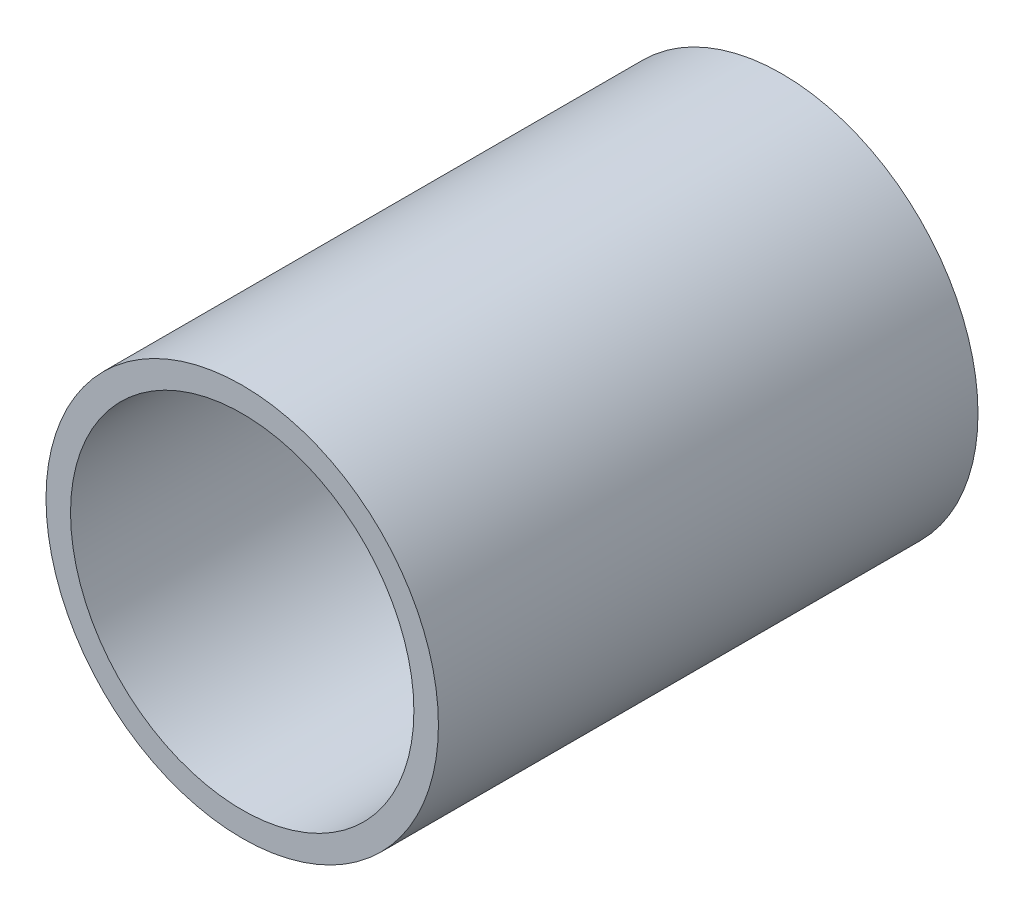
ISO-10303-21;
HEADER;
FILE_DESCRIPTION(('STEP AP214'),'2;1');
FILE_NAME('part.step','',(''),(''),'','','');
FILE_SCHEMA(('AUTOMOTIVE_DESIGN { 1 0 10303 214 1 1 1 1 }'));
ENDSEC;
DATA;
#1=APPLICATION_CONTEXT('core data for automotive mechanical design processes');
#2=APPLICATION_PROTOCOL_DEFINITION('international standard','automotive_design',2000,#1);
#3=PRODUCT_CONTEXT('',#1,'mechanical');
#4=PRODUCT('Part','Part','',(#3));
#5=PRODUCT_RELATED_PRODUCT_CATEGORY('part','',(#4));
#6=PRODUCT_DEFINITION_FORMATION('','',#4);
#7=PRODUCT_DEFINITION_CONTEXT('part definition',#1,'design');
#8=PRODUCT_DEFINITION('design','',#6,#7);
#9=PRODUCT_DEFINITION_SHAPE('','',#8);
#10=(LENGTH_UNIT() NAMED_UNIT(*) SI_UNIT(.MILLI.,.METRE.));
#11=(NAMED_UNIT(*) PLANE_ANGLE_UNIT() SI_UNIT($,.RADIAN.));
#12=(NAMED_UNIT(*) SI_UNIT($,.STERADIAN.) SOLID_ANGLE_UNIT());
#13=UNCERTAINTY_MEASURE_WITH_UNIT(LENGTH_MEASURE(1.E-05),#10,'distance_accuracy_value','');
#14=(GEOMETRIC_REPRESENTATION_CONTEXT(3) GLOBAL_UNCERTAINTY_ASSIGNED_CONTEXT((#13)) GLOBAL_UNIT_ASSIGNED_CONTEXT((#10,
#11,#12)) REPRESENTATION_CONTEXT('',''));
#15=CARTESIAN_POINT('',(0.,0.,0.));
#16=DIRECTION('',(0.,0.,1.));
#17=DIRECTION('',(1.,0.,0.));
#18=AXIS2_PLACEMENT_3D('',#15,#16,#17);
#19=CARTESIAN_POINT('',(0.,0.,110.));
#20=DIRECTION('',(0.,0.,1.));
#21=DIRECTION('',(1.,0.,0.));
#22=AXIS2_PLACEMENT_3D('',#19,#20,#21);
#23=PLANE('',#22);
#24=CARTESIAN_POINT('',(0.,0.,110.));
#25=DIRECTION('',(0.,0.,1.));
#26=DIRECTION('',(1.,0.,0.));
#27=AXIS2_PLACEMENT_3D('',#24,#25,#26);
#28=CIRCLE('',#27,40.);
#29=CARTESIAN_POINT('',(40.,0.,110.));
#30=VERTEX_POINT('',#29);
#31=EDGE_CURVE('E10',#30,#30,#28,.T.);
#32=ORIENTED_EDGE('',*,*,#31,.T.);
#33=EDGE_LOOP('',(#32));
#34=FACE_BOUND('',#33,.T.);
#35=CARTESIAN_POINT('',(0.,0.,110.));
#36=DIRECTION('',(0.,0.,1.));
#37=DIRECTION('',(1.,0.,0.));
#38=AXIS2_PLACEMENT_3D('',#35,#36,#37);
#39=CIRCLE('',#38,35.);
#40=CARTESIAN_POINT('',(35.,0.,110.));
#41=VERTEX_POINT('',#40);
#42=EDGE_CURVE('E47',#41,#41,#39,.T.);
#43=ORIENTED_EDGE('',*,*,#42,.F.);
#44=EDGE_LOOP('',(#43));
#45=FACE_BOUND('',#44,.T.);
#46=ADVANCED_FACE('F36',(#34,#45),#23,.T.);
#47=CARTESIAN_POINT('',(0.,0.,0.));
#48=DIRECTION('',(0.,0.,1.));
#49=DIRECTION('',(1.,0.,0.));
#50=AXIS2_PLACEMENT_3D('',#47,#48,#49);
#51=PLANE('',#50);
#52=CARTESIAN_POINT('',(0.,0.,0.));
#53=DIRECTION('',(0.,0.,1.));
#54=DIRECTION('',(1.,0.,0.));
#55=AXIS2_PLACEMENT_3D('',#52,#53,#54);
#56=CIRCLE('',#55,40.);
#57=CARTESIAN_POINT('',(40.,0.,0.));
#58=VERTEX_POINT('',#57);
#59=EDGE_CURVE('E40',#58,#58,#56,.T.);
#60=ORIENTED_EDGE('',*,*,#59,.F.);
#61=EDGE_LOOP('',(#60));
#62=FACE_BOUND('',#61,.T.);
#63=CARTESIAN_POINT('',(0.,0.,0.));
#64=DIRECTION('',(0.,0.,1.));
#65=DIRECTION('',(1.,0.,0.));
#66=AXIS2_PLACEMENT_3D('',#63,#64,#65);
#67=CIRCLE('',#66,35.);
#68=CARTESIAN_POINT('',(35.,0.,0.));
#69=VERTEX_POINT('',#68);
#70=EDGE_CURVE('E49',#69,#69,#67,.T.);
#71=ORIENTED_EDGE('',*,*,#70,.T.);
#72=EDGE_LOOP('',(#71));
#73=FACE_BOUND('',#72,.T.);
#74=ADVANCED_FACE('F59',(#62,#73),#51,.F.);
#75=CARTESIAN_POINT('',(0.,0.,110.));
#76=DIRECTION('',(0.,0.,-1.));
#77=DIRECTION('',(-1.,0.,0.));
#78=AXIS2_PLACEMENT_3D('',#75,#76,#77);
#79=CYLINDRICAL_SURFACE('',#78,40.);
#80=ORIENTED_EDGE('',*,*,#31,.F.);
#81=EDGE_LOOP('',(#80));
#82=FACE_BOUND('',#81,.T.);
#83=ORIENTED_EDGE('',*,*,#59,.T.);
#84=EDGE_LOOP('',(#83));
#85=FACE_BOUND('',#84,.T.);
#86=ADVANCED_FACE('F38',(#82,#85),#79,.T.);
#87=CARTESIAN_POINT('',(0.,0.,110.));
#88=DIRECTION('',(0.,0.,-1.));
#89=DIRECTION('',(-1.,0.,0.));
#90=AXIS2_PLACEMENT_3D('',#87,#88,#89);
#91=CYLINDRICAL_SURFACE('',#90,35.);
#92=ORIENTED_EDGE('',*,*,#42,.T.);
#93=EDGE_LOOP('',(#92));
#94=FACE_BOUND('',#93,.T.);
#95=ORIENTED_EDGE('',*,*,#70,.F.);
#96=EDGE_LOOP('',(#95));
#97=FACE_BOUND('',#96,.T.);
#98=ADVANCED_FACE('F55',(#94,#97),#91,.F.);
#99=CLOSED_SHELL('',(#46,#74,#86,#98));
#100=MANIFOLD_SOLID_BREP('B2',#99);
#101=ADVANCED_BREP_SHAPE_REPRESENTATION('',(#18,#100),#14);
#102=SHAPE_DEFINITION_REPRESENTATION(#9,#101);
ENDSEC;
END-ISO-10303-21;
